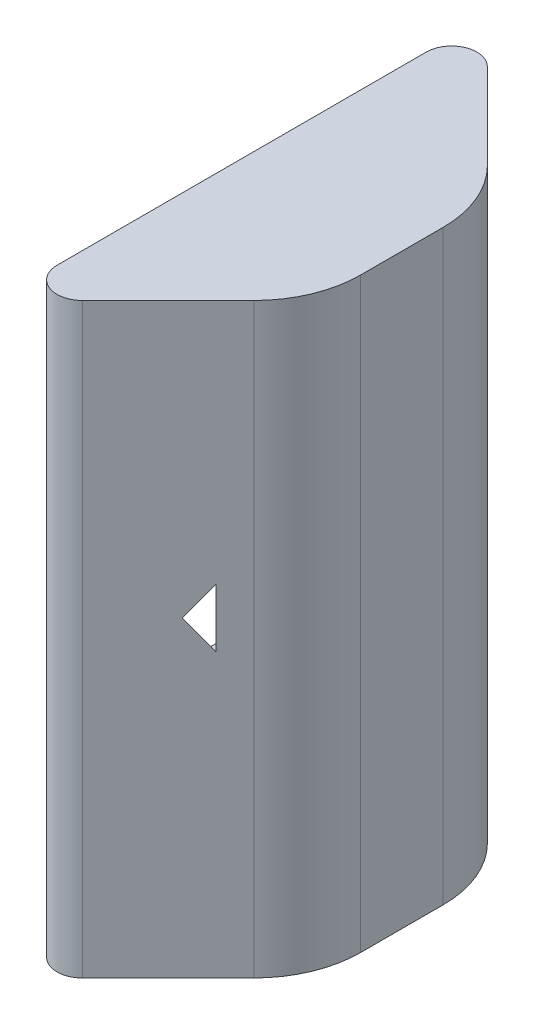
ISO-10303-21;
HEADER;
FILE_DESCRIPTION(('STEP AP214'),'2;1');
FILE_NAME('part.step','',(''),(''),'','','');
FILE_SCHEMA(('AUTOMOTIVE_DESIGN { 1 0 10303 214 1 1 1 1 }'));
ENDSEC;
DATA;
#1=APPLICATION_CONTEXT('core data for automotive mechanical design processes');
#2=APPLICATION_PROTOCOL_DEFINITION('international standard','automotive_design',2000,#1);
#3=PRODUCT_CONTEXT('',#1,'mechanical');
#4=PRODUCT('Part','Part','',(#3));
#5=PRODUCT_RELATED_PRODUCT_CATEGORY('part','',(#4));
#6=PRODUCT_DEFINITION_FORMATION('','',#4);
#7=PRODUCT_DEFINITION_CONTEXT('part definition',#1,'design');
#8=PRODUCT_DEFINITION('design','',#6,#7);
#9=PRODUCT_DEFINITION_SHAPE('','',#8);
#10=(LENGTH_UNIT() NAMED_UNIT(*) SI_UNIT(.MILLI.,.METRE.));
#11=(NAMED_UNIT(*) PLANE_ANGLE_UNIT() SI_UNIT($,.RADIAN.));
#12=(NAMED_UNIT(*) SI_UNIT($,.STERADIAN.) SOLID_ANGLE_UNIT());
#13=UNCERTAINTY_MEASURE_WITH_UNIT(LENGTH_MEASURE(1.E-05),#10,'distance_accuracy_value','');
#14=(GEOMETRIC_REPRESENTATION_CONTEXT(3) GLOBAL_UNCERTAINTY_ASSIGNED_CONTEXT((#13)) GLOBAL_UNIT_ASSIGNED_CONTEXT((#10,
#11,#12)) REPRESENTATION_CONTEXT('',''));
#15=CARTESIAN_POINT('',(0.,0.,0.));
#16=DIRECTION('',(0.,0.,1.));
#17=DIRECTION('',(1.,0.,0.));
#18=AXIS2_PLACEMENT_3D('',#15,#16,#17);
#19=CARTESIAN_POINT('',(634.903700874875,898.368143730619,1272.18749392615));
#20=DIRECTION('',(0.,-1.,0.));
#21=DIRECTION('',(1.,0.,0.));
#22=AXIS2_PLACEMENT_3D('',#19,#20,#21);
#23=CYLINDRICAL_SURFACE('',#22,2.91000000000478);
#24=CARTESIAN_POINT('',(634.903700874875,882.368143730619,1272.18749392615));
#25=DIRECTION('',(0.,1.,0.));
#26=DIRECTION('',(-1.,0.,0.));
#27=AXIS2_PLACEMENT_3D('',#24,#25,#26);
#28=CIRCLE('',#27,2.91000000000478);
#29=CARTESIAN_POINT('',(636.961381608131,882.368143730619,1274.2451746594));
#30=VERTEX_POINT('',#29);
#31=CARTESIAN_POINT('',(637.813700874879,882.368143730619,1272.18749392009));
#32=VERTEX_POINT('',#31);
#33=EDGE_CURVE('E253',#30,#32,#28,.T.);
#34=ORIENTED_EDGE('',*,*,#33,.T.);
#35=DIRECTION('',(0.,-1.,0.));
#36=VECTOR('',#35,1.);
#37=CARTESIAN_POINT('',(637.813700874879,898.368143730619,1272.18749392009));
#38=LINE('',#37,#36);
#39=CARTESIAN_POINT('',(637.813700874879,898.368143730619,1272.18749392009));
#40=VERTEX_POINT('',#39);
#41=EDGE_CURVE('E343',#40,#32,#38,.T.);
#42=ORIENTED_EDGE('',*,*,#41,.F.);
#43=CARTESIAN_POINT('',(634.903700874875,898.368143730619,1272.18749392615));
#44=DIRECTION('',(0.,1.,0.));
#45=DIRECTION('',(-1.,0.,0.));
#46=AXIS2_PLACEMENT_3D('',#43,#44,#45);
#47=CIRCLE('',#46,2.91000000000478);
#48=CARTESIAN_POINT('',(636.961381608131,898.368143730619,1274.2451746594));
#49=VERTEX_POINT('',#48);
#50=EDGE_CURVE('E254',#49,#40,#47,.T.);
#51=ORIENTED_EDGE('',*,*,#50,.F.);
#52=DIRECTION('',(0.,-1.,0.));
#53=VECTOR('',#52,1.);
#54=CARTESIAN_POINT('',(636.961381608131,898.368143730619,1274.2451746594));
#55=LINE('',#54,#53);
#56=EDGE_CURVE('E286',#49,#30,#55,.T.);
#57=ORIENTED_EDGE('',*,*,#56,.T.);
#58=EDGE_LOOP('',(#34,#42,#51,#57));
#59=FACE_BOUND('',#58,.T.);
#60=ADVANCED_FACE('F45',(#59),#23,.T.);
#61=CARTESIAN_POINT('',(637.813700874879,898.368143730619,1272.18749392009));
#62=DIRECTION('',(-1.,0.,2.10075819805635E-09));
#63=DIRECTION('',(2.10075819805635E-09,0.,1.));
#64=AXIS2_PLACEMENT_3D('',#61,#62,#63);
#65=PLANE('',#64);
#66=DIRECTION('',(-2.10075819805635E-09,0.,-1.));
#67=VECTOR('',#66,1.);
#68=CARTESIAN_POINT('',(637.813700874879,882.368143730619,1272.18749392009));
#69=LINE('',#68,#67);
#70=CARTESIAN_POINT('',(637.813700870155,882.368143730619,1269.93835970152));
#71=VERTEX_POINT('',#70);
#72=EDGE_CURVE('E290',#32,#71,#69,.T.);
#73=ORIENTED_EDGE('',*,*,#72,.T.);
#74=DIRECTION('',(0.,-1.,0.));
#75=VECTOR('',#74,1.);
#76=CARTESIAN_POINT('',(637.813700870155,898.368143730619,1269.93835970152));
#77=LINE('',#76,#75);
#78=CARTESIAN_POINT('',(637.813700870155,898.368143730619,1269.93835970152));
#79=VERTEX_POINT('',#78);
#80=EDGE_CURVE('E339',#79,#71,#77,.T.);
#81=ORIENTED_EDGE('',*,*,#80,.F.);
#82=DIRECTION('',(-2.10075819805635E-09,0.,-1.));
#83=VECTOR('',#82,1.);
#84=CARTESIAN_POINT('',(637.813700874879,898.368143730619,1272.18749392009));
#85=LINE('',#84,#83);
#86=EDGE_CURVE('E258',#40,#79,#85,.T.);
#87=ORIENTED_EDGE('',*,*,#86,.F.);
#88=ORIENTED_EDGE('',*,*,#41,.T.);
#89=EDGE_LOOP('',(#73,#81,#87,#88));
#90=FACE_BOUND('',#89,.T.);
#91=ADVANCED_FACE('F414',(#90),#65,.F.);
#92=CARTESIAN_POINT('',(634.903700870169,898.368143730619,1269.93835970763));
#93=DIRECTION('',(0.,-1.,0.));
#94=DIRECTION('',(1.,0.,0.));
#95=AXIS2_PLACEMENT_3D('',#92,#93,#94);
#96=CYLINDRICAL_SURFACE('',#95,2.90999999998545);
#97=CARTESIAN_POINT('',(634.903700870169,882.368143730619,1269.93835970763));
#98=DIRECTION('',(0.,1.,0.));
#99=DIRECTION('',(-1.,0.,0.));
#100=AXIS2_PLACEMENT_3D('',#97,#98,#99);
#101=CIRCLE('',#100,2.90999999998545);
#102=CARTESIAN_POINT('',(636.961381603412,882.368143730619,1267.88067897439));
#103=VERTEX_POINT('',#102);
#104=EDGE_CURVE('E293',#71,#103,#101,.T.);
#105=ORIENTED_EDGE('',*,*,#104,.T.);
#106=DIRECTION('',(0.,-1.,0.));
#107=VECTOR('',#106,1.);
#108=CARTESIAN_POINT('',(636.961381603412,898.368143730619,1267.88067897439));
#109=LINE('',#108,#107);
#110=CARTESIAN_POINT('',(636.961381603412,898.368143730619,1267.88067897439));
#111=VERTEX_POINT('',#110);
#112=EDGE_CURVE('E335',#111,#103,#109,.T.);
#113=ORIENTED_EDGE('',*,*,#112,.F.);
#114=CARTESIAN_POINT('',(634.903700870169,898.368143730619,1269.93835970763));
#115=DIRECTION('',(0.,1.,0.));
#116=DIRECTION('',(-1.,0.,0.));
#117=AXIS2_PLACEMENT_3D('',#114,#115,#116);
#118=CIRCLE('',#117,2.90999999998545);
#119=EDGE_CURVE('E262',#79,#111,#118,.T.);
#120=ORIENTED_EDGE('',*,*,#119,.F.);
#121=ORIENTED_EDGE('',*,*,#80,.T.);
#122=EDGE_LOOP('',(#105,#113,#120,#121));
#123=FACE_BOUND('',#122,.T.);
#124=ADVANCED_FACE('F412',(#123),#96,.T.);
#125=CARTESIAN_POINT('',(636.961381603412,898.368143730619,1267.88067897439));
#126=DIRECTION('',(-0.707106781186547,0.,0.707106781186547));
#127=DIRECTION('',(0.707106781186548,0.,0.707106781186548));
#128=AXIS2_PLACEMENT_3D('',#125,#126,#127);
#129=PLANE('',#128);
#130=DIRECTION('',(-0.447213480708285,-0.774596801791462,-0.447213480708285));
#131=VECTOR('',#130,1.);
#132=CARTESIAN_POINT('',(638.976253935858,896.041570558893,1269.89555130683));
#133=LINE('',#132,#131);
#134=CARTESIAN_POINT('',(636.44369772853,891.655052789362,1267.36299509951));
#135=VERTEX_POINT('',#134);
#136=CARTESIAN_POINT('',(635.989375841718,890.868143730619,1266.90867321269));
#137=VERTEX_POINT('',#136);
#138=EDGE_CURVE('E245',#135,#137,#133,.T.);
#139=ORIENTED_EDGE('',*,*,#138,.T.);
#140=DIRECTION('',(0.447213515445306,-0.774596761680619,0.447213515445306));
#141=VECTOR('',#140,1.);
#142=CARTESIAN_POINT('',(633.780101870149,894.694719405838,1264.69939924112));
#143=LINE('',#142,#141);
#144=CARTESIAN_POINT('',(636.44369772853,890.081234803029,1267.36299509951));
#145=VERTEX_POINT('',#144);
#146=EDGE_CURVE('E249',#137,#145,#143,.T.);
#147=ORIENTED_EDGE('',*,*,#146,.T.);
#148=DIRECTION('',(0.,1.,0.));
#149=VECTOR('',#148,1.);
#150=CARTESIAN_POINT('',(636.443697728531,898.368143730619,1267.36299509951));
#151=LINE('',#150,#149);
#152=EDGE_CURVE('E230',#145,#135,#151,.T.);
#153=ORIENTED_EDGE('',*,*,#152,.T.);
#154=EDGE_LOOP('',(#139,#147,#153));
#155=FACE_BOUND('',#154,.T.);
#156=DIRECTION('',(-0.707106781186547,0.,-0.707106781186547));
#157=VECTOR('',#156,1.);
#158=CARTESIAN_POINT('',(636.961381603412,882.368143730619,1267.88067897439));
#159=LINE('',#158,#157);
#160=CARTESIAN_POINT('',(634.621604572619,882.368143730619,1265.54090194359));
#161=VERTEX_POINT('',#160);
#162=EDGE_CURVE('E296',#103,#161,#159,.T.);
#163=ORIENTED_EDGE('',*,*,#162,.T.);
#164=DIRECTION('',(0.,-1.,0.));
#165=VECTOR('',#164,1.);
#166=CARTESIAN_POINT('',(634.621604572619,898.368143730619,1265.54090194359));
#167=LINE('',#166,#165);
#168=CARTESIAN_POINT('',(634.621604572619,898.368143730619,1265.54090194359));
#169=VERTEX_POINT('',#168);
#170=EDGE_CURVE('E331',#169,#161,#167,.T.);
#171=ORIENTED_EDGE('',*,*,#170,.F.);
#172=DIRECTION('',(-0.707106781186547,0.,-0.707106781186547));
#173=VECTOR('',#172,1.);
#174=CARTESIAN_POINT('',(636.961381603412,898.368143730619,1267.88067897439));
#175=LINE('',#174,#173);
#176=EDGE_CURVE('E265',#111,#169,#175,.T.);
#177=ORIENTED_EDGE('',*,*,#176,.F.);
#178=ORIENTED_EDGE('',*,*,#112,.T.);
#179=EDGE_LOOP('',(#163,#171,#177,#178));
#180=FACE_BOUND('',#179,.T.);
#181=ADVANCED_FACE('F368',(#155,#180),#129,.F.);
#182=CARTESIAN_POINT('',(634.1337008936,898.368143730619,1266.02880562261));
#183=DIRECTION('',(0.,-1.,0.));
#184=DIRECTION('',(1.,0.,0.));
#185=AXIS2_PLACEMENT_3D('',#182,#183,#184);
#186=CYLINDRICAL_SURFACE('',#185,0.689999999999779);
#187=CARTESIAN_POINT('',(634.1337008936,882.368143730619,1266.02880562261));
#188=DIRECTION('',(0.,1.,0.));
#189=DIRECTION('',(-1.,0.,0.));
#190=AXIS2_PLACEMENT_3D('',#187,#188,#189);
#191=CIRCLE('',#190,0.689999999999779);
#192=CARTESIAN_POINT('',(633.4437008936,882.368143730619,1266.02880537402));
#193=VERTEX_POINT('',#192);
#194=EDGE_CURVE('E299',#161,#193,#191,.T.);
#195=ORIENTED_EDGE('',*,*,#194,.T.);
#196=DIRECTION('',(0.,-1.,0.));
#197=VECTOR('',#196,1.);
#198=CARTESIAN_POINT('',(633.4437008936,898.368143730619,1266.02880537402));
#199=LINE('',#198,#197);
#200=CARTESIAN_POINT('',(633.4437008936,898.368143730619,1266.02880537402));
#201=VERTEX_POINT('',#200);
#202=EDGE_CURVE('E327',#201,#193,#199,.T.);
#203=ORIENTED_EDGE('',*,*,#202,.F.);
#204=CARTESIAN_POINT('',(634.1337008936,898.368143730619,1266.02880562261));
#205=DIRECTION('',(0.,1.,0.));
#206=DIRECTION('',(-1.,0.,0.));
#207=AXIS2_PLACEMENT_3D('',#204,#205,#206);
#208=CIRCLE('',#207,0.689999999999779);
#209=EDGE_CURVE('E268',#169,#201,#208,.T.);
#210=ORIENTED_EDGE('',*,*,#209,.F.);
#211=ORIENTED_EDGE('',*,*,#170,.T.);
#212=EDGE_LOOP('',(#195,#203,#210,#211));
#213=FACE_BOUND('',#212,.T.);
#214=ADVANCED_FACE('F376',(#213),#186,.T.);
#215=CARTESIAN_POINT('',(633.443700112092,898.368143730619,1273.92792667765));
#216=DIRECTION('',(0.999999999999934,0.,-3.63074991381097E-07));
#217=DIRECTION('',(-3.63074991381097E-07,0.,-0.999999999999934));
#218=AXIS2_PLACEMENT_3D('',#215,#216,#217);
#219=PLANE('',#218);
#220=DIRECTION('',(3.63075000390763E-07,0.,0.999999999999934));
#221=VECTOR('',#220,1.);
#222=CARTESIAN_POINT('',(633.443699072852,887.268143730619,1271.06559600786));
#223=LINE('',#222,#221);
#224=CARTESIAN_POINT('',(633.443698318214,887.268143730619,1268.98713401682));
#225=VERTEX_POINT('',#224);
#226=CARTESIAN_POINT('',(633.443699827489,887.268143730619,1273.14405704421));
#227=VERTEX_POINT('',#226);
#228=EDGE_CURVE('E184',#225,#227,#223,.T.);
#229=ORIENTED_EDGE('',*,*,#228,.F.);
#230=DIRECTION('',(1.81537504279988E-07,-0.866025389770243,0.500000024273266));
#231=VECTOR('',#230,1.);
#232=CARTESIAN_POINT('',(633.443698318215,887.268143730619,1268.98713510605));
#233=LINE('',#232,#231);
#234=CARTESIAN_POINT('',(633.443697563578,890.868143730619,1266.90867413697));
#235=VERTEX_POINT('',#234);
#236=EDGE_CURVE('E68',#235,#225,#233,.T.);
#237=ORIENTED_EDGE('',*,*,#236,.F.);
#238=DIRECTION('',(-1.81537510330031E-07,-0.866025417798554,-0.499999975726806));
#239=VECTOR('',#238,1.);
#240=CARTESIAN_POINT('',(633.443697563578,890.868143730619,1266.90867413697));
#241=LINE('',#240,#239);
#242=CARTESIAN_POINT('',(633.443698318215,894.468143730621,1268.98713510605));
#243=VERTEX_POINT('',#242);
#244=EDGE_CURVE('E221',#243,#235,#241,.T.);
#245=ORIENTED_EDGE('',*,*,#244,.F.);
#246=DIRECTION('',(-3.63074972182134E-07,0.,-0.999999999999934));
#247=VECTOR('',#246,1.);
#248=CARTESIAN_POINT('',(633.443699072852,894.468143730621,1271.0655959981));
#249=LINE('',#248,#247);
#250=CARTESIAN_POINT('',(633.443699827489,894.468143730621,1273.14405704421));
#251=VERTEX_POINT('',#250);
#252=EDGE_CURVE('E217',#251,#243,#249,.T.);
#253=ORIENTED_EDGE('',*,*,#252,.F.);
#254=DIRECTION('',(-1.81537508763382E-07,0.866025417798388,-0.499999975727095));
#255=VECTOR('',#254,1.);
#256=CARTESIAN_POINT('',(633.443699827489,894.468143730621,1273.14405704421));
#257=LINE('',#256,#255);
#258=CARTESIAN_POINT('',(633.443700582126,890.868143730621,1275.2225180133));
#259=VERTEX_POINT('',#258);
#260=EDGE_CURVE('E213',#259,#251,#257,.T.);
#261=ORIENTED_EDGE('',*,*,#260,.F.);
#262=DIRECTION('',(1.81537502888108E-07,0.866025389770583,0.500000024272676));
#263=VECTOR('',#262,1.);
#264=CARTESIAN_POINT('',(633.443700582126,890.868143730621,1275.2225180133));
#265=LINE('',#264,#263);
#266=EDGE_CURVE('E210',#227,#259,#265,.T.);
#267=ORIENTED_EDGE('',*,*,#266,.F.);
#268=EDGE_LOOP('',(#229,#237,#245,#253,#261,#267));
#269=FACE_BOUND('',#268,.T.);
#270=DIRECTION('',(3.63074991381097E-07,0.,0.999999999999934));
#271=VECTOR('',#270,1.);
#272=CARTESIAN_POINT('',(633.443700112092,882.368143730619,1273.92792667765));
#273=LINE('',#272,#271);
#274=CARTESIAN_POINT('',(633.443700112092,882.368143730619,1273.92792667765));
#275=VERTEX_POINT('',#274);
#276=CARTESIAN_POINT('',(633.443700899646,882.368143730619,1276.09704826037));
#277=VERTEX_POINT('',#276);
#278=EDGE_CURVE('E308',#275,#277,#273,.T.);
#279=ORIENTED_EDGE('',*,*,#278,.T.);
#280=DIRECTION('',(0.,-1.,0.));
#281=VECTOR('',#280,1.);
#282=CARTESIAN_POINT('',(633.443700899646,898.368143730619,1276.09704826037));
#283=LINE('',#282,#281);
#284=CARTESIAN_POINT('',(633.443700899646,898.368143730619,1276.09704826037));
#285=VERTEX_POINT('',#284);
#286=EDGE_CURVE('E323',#285,#277,#283,.T.);
#287=ORIENTED_EDGE('',*,*,#286,.F.);
#288=DIRECTION('',(3.63074991381097E-07,0.,0.999999999999934));
#289=VECTOR('',#288,1.);
#290=CARTESIAN_POINT('',(633.443700112092,898.368143730619,1273.92792667765));
#291=LINE('',#290,#289);
#292=CARTESIAN_POINT('',(633.443700112092,898.368143730619,1273.92792667765));
#293=VERTEX_POINT('',#292);
#294=EDGE_CURVE('E277',#293,#285,#291,.T.);
#295=ORIENTED_EDGE('',*,*,#294,.F.);
#296=DIRECTION('',(6.58771111619776E-13,0.,1.));
#297=VECTOR('',#296,1.);
#298=CARTESIAN_POINT('',(633.443700112089,898.368143730619,1268.19792695977));
#299=LINE('',#298,#297);
#300=CARTESIAN_POINT('',(633.443700112089,898.368143730619,1268.19792695977));
#301=VERTEX_POINT('',#300);
#302=EDGE_CURVE('E274',#301,#293,#299,.T.);
#303=ORIENTED_EDGE('',*,*,#302,.F.);
#304=DIRECTION('',(-3.60289557008273E-07,0.,0.999999999999935));
#305=VECTOR('',#304,1.);
#306=CARTESIAN_POINT('',(633.443700893601,898.368143730619,1266.02880537402));
#307=LINE('',#306,#305);
#308=EDGE_CURVE('E271',#201,#301,#307,.T.);
#309=ORIENTED_EDGE('',*,*,#308,.F.);
#310=ORIENTED_EDGE('',*,*,#202,.T.);
#311=DIRECTION('',(-3.60289557008273E-07,0.,0.999999999999935));
#312=VECTOR('',#311,1.);
#313=CARTESIAN_POINT('',(633.443700893601,882.368143730619,1266.02880537402));
#314=LINE('',#313,#312);
#315=CARTESIAN_POINT('',(633.443700112089,882.368143730619,1268.19792695977));
#316=VERTEX_POINT('',#315);
#317=EDGE_CURVE('E302',#193,#316,#314,.T.);
#318=ORIENTED_EDGE('',*,*,#317,.T.);
#319=DIRECTION('',(6.58771111619776E-13,0.,1.));
#320=VECTOR('',#319,1.);
#321=CARTESIAN_POINT('',(633.443700112089,882.368143730619,1268.19792695977));
#322=LINE('',#321,#320);
#323=EDGE_CURVE('E305',#316,#275,#322,.T.);
#324=ORIENTED_EDGE('',*,*,#323,.T.);
#325=EDGE_LOOP('',(#279,#287,#295,#303,#309,#310,#318,#324));
#326=FACE_BOUND('',#325,.T.);
#327=ADVANCED_FACE('F372',(#269,#326),#219,.F.);
#328=CARTESIAN_POINT('',(634.133700899643,898.368143730619,1276.09704800986));
#329=DIRECTION('',(0.,-1.,0.));
#330=DIRECTION('',(1.,0.,0.));
#331=AXIS2_PLACEMENT_3D('',#328,#329,#330);
#332=CYLINDRICAL_SURFACE('',#331,0.689999999997262);
#333=CARTESIAN_POINT('',(634.133700899643,882.368143730619,1276.09704800986));
#334=DIRECTION('',(0.,1.,0.));
#335=DIRECTION('',(-1.,0.,0.));
#336=AXIS2_PLACEMENT_3D('',#333,#334,#335);
#337=CIRCLE('',#336,0.689999999997262);
#338=CARTESIAN_POINT('',(634.62160457866,882.368143730619,1276.58495168888));
#339=VERTEX_POINT('',#338);
#340=EDGE_CURVE('E311',#277,#339,#337,.T.);
#341=ORIENTED_EDGE('',*,*,#340,.T.);
#342=DIRECTION('',(0.,-1.,0.));
#343=VECTOR('',#342,1.);
#344=CARTESIAN_POINT('',(634.62160457866,898.368143730619,1276.58495168888));
#345=LINE('',#344,#343);
#346=CARTESIAN_POINT('',(634.62160457866,898.368143730619,1276.58495168888));
#347=VERTEX_POINT('',#346);
#348=EDGE_CURVE('E319',#347,#339,#345,.T.);
#349=ORIENTED_EDGE('',*,*,#348,.F.);
#350=CARTESIAN_POINT('',(634.133700899643,898.368143730619,1276.09704800986));
#351=DIRECTION('',(0.,1.,0.));
#352=DIRECTION('',(-1.,0.,0.));
#353=AXIS2_PLACEMENT_3D('',#350,#351,#352);
#354=CIRCLE('',#353,0.689999999997262);
#355=EDGE_CURVE('E280',#285,#347,#354,.T.);
#356=ORIENTED_EDGE('',*,*,#355,.F.);
#357=ORIENTED_EDGE('',*,*,#286,.T.);
#358=EDGE_LOOP('',(#341,#349,#356,#357));
#359=FACE_BOUND('',#358,.T.);
#360=ADVANCED_FACE('F375',(#359),#332,.T.);
#361=CARTESIAN_POINT('',(634.62160457866,898.368143730619,1276.58495168888));
#362=DIRECTION('',(-0.707106781186581,0.,-0.707106781186514));
#363=DIRECTION('',(-0.707106781186514,0.,0.707106781186581));
#364=AXIS2_PLACEMENT_3D('',#361,#362,#363);
#365=PLANE('',#364);
#366=DIRECTION('',(-0.447213710291335,0.774596536691766,0.447213710291377));
#367=VECTOR('',#366,1.);
#368=CARTESIAN_POINT('',(632.840988623994,896.312064649524,1278.36556764354));
#369=LINE('',#368,#367);
#370=CARTESIAN_POINT('',(636.443700415235,890.071987581541,1274.7628558523));
#371=VERTEX_POINT('',#370);
#372=CARTESIAN_POINT('',(635.984039176574,890.868143730621,1275.22251709096));
#373=VERTEX_POINT('',#372);
#374=EDGE_CURVE('E53',#371,#373,#369,.T.);
#375=ORIENTED_EDGE('',*,*,#374,.T.);
#376=DIRECTION('',(0.447213675554946,0.774596576801907,-0.447213675554989));
#377=VECTOR('',#376,1.);
#378=CARTESIAN_POINT('',(638.037141589398,894.424220128807,1273.16941467814));
#379=LINE('',#378,#377);
#380=CARTESIAN_POINT('',(636.443700415235,891.664300009653,1274.7628558523));
#381=VERTEX_POINT('',#380);
#382=EDGE_CURVE('E11',#373,#381,#379,.T.);
#383=ORIENTED_EDGE('',*,*,#382,.T.);
#384=DIRECTION('',(0.,-1.,0.));
#385=VECTOR('',#384,1.);
#386=CARTESIAN_POINT('',(636.443700415235,898.368143730619,1274.7628558523));
#387=LINE('',#386,#385);
#388=EDGE_CURVE('E347',#381,#371,#387,.T.);
#389=ORIENTED_EDGE('',*,*,#388,.T.);
#390=EDGE_LOOP('',(#375,#383,#389));
#391=FACE_BOUND('',#390,.T.);
#392=DIRECTION('',(0.707106781186514,0.,-0.707106781186581));
#393=VECTOR('',#392,1.);
#394=CARTESIAN_POINT('',(634.62160457866,882.368143730619,1276.58495168888));
#395=LINE('',#394,#393);
#396=EDGE_CURVE('E259',#339,#30,#395,.T.);
#397=ORIENTED_EDGE('',*,*,#396,.T.);
#398=ORIENTED_EDGE('',*,*,#56,.F.);
#399=DIRECTION('',(0.707106781186514,0.,-0.707106781186581));
#400=VECTOR('',#399,1.);
#401=CARTESIAN_POINT('',(634.62160457866,898.368143730619,1276.58495168888));
#402=LINE('',#401,#400);
#403=EDGE_CURVE('E283',#347,#49,#402,.T.);
#404=ORIENTED_EDGE('',*,*,#403,.F.);
#405=ORIENTED_EDGE('',*,*,#348,.T.);
#406=EDGE_LOOP('',(#397,#398,#404,#405));
#407=FACE_BOUND('',#406,.T.);
#408=ADVANCED_FACE('F351',(#391,#407),#365,.F.);
#409=CARTESIAN_POINT('',(634.903700874875,898.368143730619,1272.18749392615));
#410=DIRECTION('',(0.,1.,0.));
#411=DIRECTION('',(-1.,0.,0.));
#412=AXIS2_PLACEMENT_3D('',#409,#410,#411);
#413=PLANE('',#412);
#414=ORIENTED_EDGE('',*,*,#50,.T.);
#415=ORIENTED_EDGE('',*,*,#86,.T.);
#416=ORIENTED_EDGE('',*,*,#119,.T.);
#417=ORIENTED_EDGE('',*,*,#176,.T.);
#418=ORIENTED_EDGE('',*,*,#209,.T.);
#419=ORIENTED_EDGE('',*,*,#308,.T.);
#420=ORIENTED_EDGE('',*,*,#302,.T.);
#421=ORIENTED_EDGE('',*,*,#294,.T.);
#422=ORIENTED_EDGE('',*,*,#355,.T.);
#423=ORIENTED_EDGE('',*,*,#403,.T.);
#424=EDGE_LOOP('',(#414,#415,#416,#417,#418,#419,#420,#421,#422,#423));
#425=FACE_BOUND('',#424,.T.);
#426=ADVANCED_FACE('F396',(#425),#413,.T.);
#427=CARTESIAN_POINT('',(634.903700874875,882.368143730619,1272.18749392615));
#428=DIRECTION('',(0.,1.,0.));
#429=DIRECTION('',(-1.,0.,0.));
#430=AXIS2_PLACEMENT_3D('',#427,#428,#429);
#431=PLANE('',#430);
#432=ORIENTED_EDGE('',*,*,#33,.F.);
#433=ORIENTED_EDGE('',*,*,#396,.F.);
#434=ORIENTED_EDGE('',*,*,#340,.F.);
#435=ORIENTED_EDGE('',*,*,#278,.F.);
#436=ORIENTED_EDGE('',*,*,#323,.F.);
#437=ORIENTED_EDGE('',*,*,#317,.F.);
#438=ORIENTED_EDGE('',*,*,#194,.F.);
#439=ORIENTED_EDGE('',*,*,#162,.F.);
#440=ORIENTED_EDGE('',*,*,#104,.F.);
#441=ORIENTED_EDGE('',*,*,#72,.F.);
#442=EDGE_LOOP('',(#432,#433,#434,#435,#436,#437,#438,#439,#440,#441));
#443=FACE_BOUND('',#442,.T.);
#444=ADVANCED_FACE('F389',(#443),#431,.F.);
#445=CARTESIAN_POINT('',(636.443698318215,887.268143730619,1268.98713401682));
#446=DIRECTION('',(-3.14432160804178E-07,-0.500000024273299,-0.866025389770185));
#447=DIRECTION('',(0.,0.866025389770228,-0.500000024273324));
#448=AXIS2_PLACEMENT_3D('',#445,#446,#447);
#449=PLANE('',#448);
#450=DIRECTION('',(-0.999999999999934,0.,3.63074991381097E-07));
#451=VECTOR('',#450,1.);
#452=CARTESIAN_POINT('',(636.443697563577,890.868143730619,1266.90867304774));
#453=LINE('',#452,#451);
#454=EDGE_CURVE('E231',#137,#235,#453,.T.);
#455=ORIENTED_EDGE('',*,*,#454,.T.);
#456=ORIENTED_EDGE('',*,*,#236,.T.);
#457=DIRECTION('',(-0.999999999999934,0.,3.63074991381097E-07));
#458=VECTOR('',#457,1.);
#459=CARTESIAN_POINT('',(636.443698318215,887.268143730619,1268.98713401682));
#460=LINE('',#459,#458);
#461=CARTESIAN_POINT('',(636.443698318215,887.268143730619,1268.98713401682));
#462=VERTEX_POINT('',#461);
#463=EDGE_CURVE('E227',#462,#225,#460,.T.);
#464=ORIENTED_EDGE('',*,*,#463,.F.);
#465=DIRECTION('',(1.81537507861082E-07,-0.866025417798356,0.49999997572715));
#466=VECTOR('',#465,1.);
#467=CARTESIAN_POINT('',(636.443697940896,889.068143719245,1267.94790347158));
#468=LINE('',#467,#466);
#469=EDGE_CURVE('E176',#145,#462,#468,.T.);
#470=ORIENTED_EDGE('',*,*,#469,.F.);
#471=ORIENTED_EDGE('',*,*,#146,.F.);
#472=EDGE_LOOP('',(#455,#456,#464,#470,#471));
#473=FACE_BOUND('',#472,.T.);
#474=ADVANCED_FACE('F370',(#473),#449,.F.);
#475=CARTESIAN_POINT('',(636.443697563577,890.868143730619,1266.90867304774));
#476=DIRECTION('',(-3.14432171225486E-07,0.499999975726839,-0.866025417798497));
#477=DIRECTION('',(0.,0.86602541779854,0.499999975726864));
#478=AXIS2_PLACEMENT_3D('',#475,#476,#477);
#479=PLANE('',#478);
#480=DIRECTION('',(-1.8153750181095E-07,-0.86602538977037,-0.500000024273045));
#481=VECTOR('',#480,1.);
#482=CARTESIAN_POINT('',(636.443697940896,892.668143717513,1267.94790345745));
#483=LINE('',#482,#481);
#484=CARTESIAN_POINT('',(636.443698318215,894.468143730621,1268.98713401682));
#485=VERTEX_POINT('',#484);
#486=EDGE_CURVE('E60',#485,#135,#483,.T.);
#487=ORIENTED_EDGE('',*,*,#486,.F.);
#488=DIRECTION('',(-0.999999999999934,0.,3.63074991381097E-07));
#489=VECTOR('',#488,1.);
#490=CARTESIAN_POINT('',(636.443698318215,894.468143730621,1268.98713401682));
#491=LINE('',#490,#489);
#492=EDGE_CURVE('E234',#485,#243,#491,.T.);
#493=ORIENTED_EDGE('',*,*,#492,.T.);
#494=ORIENTED_EDGE('',*,*,#244,.T.);
#495=ORIENTED_EDGE('',*,*,#454,.F.);
#496=ORIENTED_EDGE('',*,*,#138,.F.);
#497=EDGE_LOOP('',(#487,#493,#494,#495,#496));
#498=FACE_BOUND('',#497,.T.);
#499=ADVANCED_FACE('F365',(#498),#479,.F.);
#500=CARTESIAN_POINT('',(636.443699827489,894.468143730621,1273.14405595499));
#501=DIRECTION('',(3.14432170980496E-07,0.499999975727128,0.86602541779833));
#502=DIRECTION('',(0.,-0.866025417798373,0.499999975727152));
#503=AXIS2_PLACEMENT_3D('',#500,#501,#502);
#504=PLANE('',#503);
#505=DIRECTION('',(-0.999999999999934,0.,3.63074991381097E-07));
#506=VECTOR('',#505,1.);
#507=CARTESIAN_POINT('',(636.443700582126,890.868143730621,1275.22251692407));
#508=LINE('',#507,#506);
#509=EDGE_CURVE('E189',#373,#259,#508,.T.);
#510=ORIENTED_EDGE('',*,*,#509,.T.);
#511=ORIENTED_EDGE('',*,*,#260,.T.);
#512=DIRECTION('',(-0.999999999999934,0.,3.63074991381097E-07));
#513=VECTOR('',#512,1.);
#514=CARTESIAN_POINT('',(636.443699827489,894.468143730621,1273.14405595499));
#515=LINE('',#514,#513);
#516=CARTESIAN_POINT('',(636.443699827489,894.468143730621,1273.14405595499));
#517=VERTEX_POINT('',#516);
#518=EDGE_CURVE('E237',#517,#251,#515,.T.);
#519=ORIENTED_EDGE('',*,*,#518,.F.);
#520=DIRECTION('',(-1.81537503377717E-07,0.866025389770349,-0.500000024273081));
#521=VECTOR('',#520,1.);
#522=CARTESIAN_POINT('',(636.443700204808,892.668143728194,1274.18328637366));
#523=LINE('',#522,#521);
#524=EDGE_CURVE('E196',#381,#517,#523,.T.);
#525=ORIENTED_EDGE('',*,*,#524,.F.);
#526=ORIENTED_EDGE('',*,*,#382,.F.);
#527=EDGE_LOOP('',(#510,#511,#519,#525,#526));
#528=FACE_BOUND('',#527,.T.);
#529=ADVANCED_FACE('F356',(#528),#504,.F.);
#530=CARTESIAN_POINT('',(636.443700582126,890.868143730621,1275.22251692407));
#531=DIRECTION('',(3.14432161049231E-07,-0.500000024272709,0.866025389770526));
#532=DIRECTION('',(0.,-0.866025389770569,-0.500000024272734));
#533=AXIS2_PLACEMENT_3D('',#530,#531,#532);
#534=PLANE('',#533);
#535=DIRECTION('',(1.81537509252903E-07,0.86602541779848,0.499999975726935));
#536=VECTOR('',#535,1.);
#537=CARTESIAN_POINT('',(636.443700204808,889.068143728193,1274.18328637086));
#538=LINE('',#537,#536);
#539=CARTESIAN_POINT('',(636.443699827489,887.268143730619,1273.14405595499));
#540=VERTEX_POINT('',#539);
#541=EDGE_CURVE('E173',#540,#371,#538,.T.);
#542=ORIENTED_EDGE('',*,*,#541,.F.);
#543=DIRECTION('',(-0.999999999999934,0.,3.63074991381097E-07));
#544=VECTOR('',#543,1.);
#545=CARTESIAN_POINT('',(636.443699827489,887.268143730619,1273.14405595499));
#546=LINE('',#545,#544);
#547=EDGE_CURVE('E181',#540,#227,#546,.T.);
#548=ORIENTED_EDGE('',*,*,#547,.T.);
#549=ORIENTED_EDGE('',*,*,#266,.T.);
#550=ORIENTED_EDGE('',*,*,#509,.F.);
#551=ORIENTED_EDGE('',*,*,#374,.F.);
#552=EDGE_LOOP('',(#542,#548,#549,#550,#551));
#553=FACE_BOUND('',#552,.T.);
#554=ADVANCED_FACE('F191',(#553),#534,.F.);
#555=CARTESIAN_POINT('',(636.443237580631,-2.40107166157222E-11,-0.000231076609757051));
#556=DIRECTION('',(0.999999999999934,0.,-3.63074970476132E-07));
#557=DIRECTION('',(-3.63074970476132E-07,0.,-0.999999999999934));
#558=AXIS2_PLACEMENT_3D('',#555,#556,#557);
#559=PLANE('',#558);
#560=ORIENTED_EDGE('',*,*,#469,.T.);
#561=DIRECTION('',(3.63074970476132E-07,0.,0.999999999999934));
#562=VECTOR('',#561,1.);
#563=CARTESIAN_POINT('',(636.443698318215,887.268143730619,1268.98713401682));
#564=LINE('',#563,#562);
#565=EDGE_CURVE('E169',#462,#540,#564,.T.);
#566=ORIENTED_EDGE('',*,*,#565,.T.);
#567=ORIENTED_EDGE('',*,*,#541,.T.);
#568=ORIENTED_EDGE('',*,*,#388,.F.);
#569=ORIENTED_EDGE('',*,*,#524,.T.);
#570=DIRECTION('',(-3.63074998684762E-07,0.,-0.999999999999934));
#571=VECTOR('',#570,1.);
#572=CARTESIAN_POINT('',(636.443699827489,894.468143730621,1273.14405595499));
#573=LINE('',#572,#571);
#574=EDGE_CURVE('E199',#517,#485,#573,.T.);
#575=ORIENTED_EDGE('',*,*,#574,.T.);
#576=ORIENTED_EDGE('',*,*,#486,.T.);
#577=ORIENTED_EDGE('',*,*,#152,.F.);
#578=EDGE_LOOP('',(#560,#566,#567,#568,#569,#575,#576,#577));
#579=FACE_BOUND('',#578,.T.);
#580=ADVANCED_FACE('F171',(#579),#559,.F.);
#581=CARTESIAN_POINT('',(636.443699072852,894.468143730621,1271.06559490887));
#582=DIRECTION('',(0.,1.,0.));
#583=DIRECTION('',(-1.,0.,0.));
#584=AXIS2_PLACEMENT_3D('',#581,#582,#583);
#585=PLANE('',#584);
#586=ORIENTED_EDGE('',*,*,#252,.T.);
#587=ORIENTED_EDGE('',*,*,#492,.F.);
#588=ORIENTED_EDGE('',*,*,#574,.F.);
#589=ORIENTED_EDGE('',*,*,#518,.T.);
#590=EDGE_LOOP('',(#586,#587,#588,#589));
#591=FACE_BOUND('',#590,.T.);
#592=ADVANCED_FACE('F362',(#591),#585,.F.);
#593=CARTESIAN_POINT('',(636.443699072852,887.268143730619,1271.06559491864));
#594=DIRECTION('',(0.,-1.,0.));
#595=DIRECTION('',(1.,0.,0.));
#596=AXIS2_PLACEMENT_3D('',#593,#594,#595);
#597=PLANE('',#596);
#598=ORIENTED_EDGE('',*,*,#228,.T.);
#599=ORIENTED_EDGE('',*,*,#547,.F.);
#600=ORIENTED_EDGE('',*,*,#565,.F.);
#601=ORIENTED_EDGE('',*,*,#463,.T.);
#602=EDGE_LOOP('',(#598,#599,#600,#601));
#603=FACE_BOUND('',#602,.T.);
#604=ADVANCED_FACE('F182',(#603),#597,.F.);
#605=CLOSED_SHELL('',(#60,#91,#124,#181,#214,#327,#360,#408,#426,#444,#474,#499,#529,#554,#580,
#592,#604));
#606=MANIFOLD_SOLID_BREP('B2',#605);
#607=ADVANCED_BREP_SHAPE_REPRESENTATION('',(#18,#606),#14);
#608=SHAPE_DEFINITION_REPRESENTATION(#9,#607);
ENDSEC;
END-ISO-10303-21;
